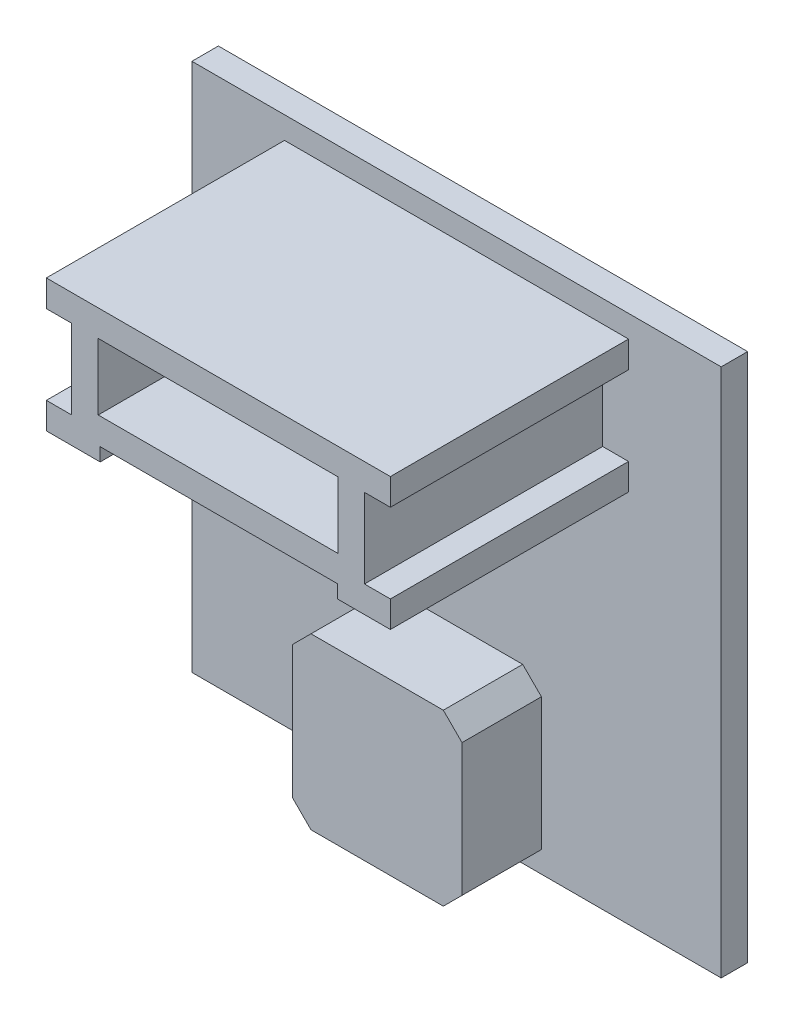
ISO-10303-21;
HEADER;
FILE_DESCRIPTION(('STEP AP214'),'2;1');
FILE_NAME('part.step','',(''),(''),'','','');
FILE_SCHEMA(('AUTOMOTIVE_DESIGN { 1 0 10303 214 1 1 1 1 }'));
ENDSEC;
DATA;
#1=APPLICATION_CONTEXT('core data for automotive mechanical design processes');
#2=APPLICATION_PROTOCOL_DEFINITION('international standard','automotive_design',2000,#1);
#3=PRODUCT_CONTEXT('',#1,'mechanical');
#4=PRODUCT('Part','Part','',(#3));
#5=PRODUCT_RELATED_PRODUCT_CATEGORY('part','',(#4));
#6=PRODUCT_DEFINITION_FORMATION('','',#4);
#7=PRODUCT_DEFINITION_CONTEXT('part definition',#1,'design');
#8=PRODUCT_DEFINITION('design','',#6,#7);
#9=PRODUCT_DEFINITION_SHAPE('','',#8);
#10=(LENGTH_UNIT() NAMED_UNIT(*) SI_UNIT(.MILLI.,.METRE.));
#11=(NAMED_UNIT(*) PLANE_ANGLE_UNIT() SI_UNIT($,.RADIAN.));
#12=(NAMED_UNIT(*) SI_UNIT($,.STERADIAN.) SOLID_ANGLE_UNIT());
#13=UNCERTAINTY_MEASURE_WITH_UNIT(LENGTH_MEASURE(1.E-05),#10,'distance_accuracy_value','');
#14=(GEOMETRIC_REPRESENTATION_CONTEXT(3) GLOBAL_UNCERTAINTY_ASSIGNED_CONTEXT((#13)) GLOBAL_UNIT_ASSIGNED_CONTEXT((#10,
#11,#12)) REPRESENTATION_CONTEXT('',''));
#15=CARTESIAN_POINT('',(0.,0.,0.));
#16=DIRECTION('',(0.,0.,1.));
#17=DIRECTION('',(1.,0.,0.));
#18=AXIS2_PLACEMENT_3D('',#15,#16,#17);
#19=CARTESIAN_POINT('',(0.,0.,0.1));
#20=DIRECTION('',(0.,0.,-1.));
#21=DIRECTION('',(-1.,0.,0.));
#22=AXIS2_PLACEMENT_3D('',#19,#20,#21);
#23=PLANE('',#22);
#24=DIRECTION('',(0.,-1.,0.));
#25=VECTOR('',#24,1.);
#26=CARTESIAN_POINT('',(0.35,1.81542552277499,0.1));
#27=LINE('',#26,#25);
#28=CARTESIAN_POINT('',(0.35,1.91603756719199,0.1));
#29=VERTEX_POINT('',#28);
#30=CARTESIAN_POINT('',(0.35,1.81542552277499,0.1));
#31=VERTEX_POINT('',#30);
#32=EDGE_CURVE('E308',#29,#31,#27,.T.);
#33=ORIENTED_EDGE('',*,*,#32,.F.);
#34=DIRECTION('',(-1.,0.,0.));
#35=VECTOR('',#34,1.);
#36=CARTESIAN_POINT('',(0.35,1.91603756719199,0.1));
#37=LINE('',#36,#35);
#38=CARTESIAN_POINT('',(1.65,1.91603756719199,0.1));
#39=VERTEX_POINT('',#38);
#40=EDGE_CURVE('E313',#39,#29,#37,.T.);
#41=ORIENTED_EDGE('',*,*,#40,.F.);
#42=DIRECTION('',(0.,1.,0.));
#43=VECTOR('',#42,1.);
#44=CARTESIAN_POINT('',(1.65,1.91603756719199,0.1));
#45=LINE('',#44,#43);
#46=CARTESIAN_POINT('',(1.65,1.81542552277499,0.1));
#47=VERTEX_POINT('',#46);
#48=EDGE_CURVE('E385',#47,#39,#45,.T.);
#49=ORIENTED_EDGE('',*,*,#48,.F.);
#50=DIRECTION('',(1.,0.,0.));
#51=VECTOR('',#50,1.);
#52=CARTESIAN_POINT('',(1.65,1.81542552277499,0.1));
#53=LINE('',#52,#51);
#54=CARTESIAN_POINT('',(1.5520790721583,1.81542552277499,0.1));
#55=VERTEX_POINT('',#54);
#56=EDGE_CURVE('E382',#55,#47,#53,.T.);
#57=ORIENTED_EDGE('',*,*,#56,.F.);
#58=DIRECTION('',(0.,1.,0.));
#59=VECTOR('',#58,1.);
#60=CARTESIAN_POINT('',(1.5520790721583,1.81542552277499,0.1));
#61=LINE('',#60,#59);
#62=CARTESIAN_POINT('',(1.5520790721583,1.51542552277499,0.1));
#63=VERTEX_POINT('',#62);
#64=EDGE_CURVE('E379',#63,#55,#61,.T.);
#65=ORIENTED_EDGE('',*,*,#64,.F.);
#66=DIRECTION('',(-1.,0.,0.));
#67=VECTOR('',#66,1.);
#68=CARTESIAN_POINT('',(1.5520790721583,1.51542552277499,0.1));
#69=LINE('',#68,#67);
#70=CARTESIAN_POINT('',(1.65,1.51542552277499,0.1));
#71=VERTEX_POINT('',#70);
#72=EDGE_CURVE('E376',#71,#63,#69,.T.);
#73=ORIENTED_EDGE('',*,*,#72,.F.);
#74=DIRECTION('',(0.,1.,0.));
#75=VECTOR('',#74,1.);
#76=CARTESIAN_POINT('',(1.65,1.51542552277499,0.1));
#77=LINE('',#76,#75);
#78=CARTESIAN_POINT('',(1.65,1.41542552277499,0.1));
#79=VERTEX_POINT('',#78);
#80=EDGE_CURVE('E373',#79,#71,#77,.T.);
#81=ORIENTED_EDGE('',*,*,#80,.F.);
#82=DIRECTION('',(1.,0.,0.));
#83=VECTOR('',#82,1.);
#84=CARTESIAN_POINT('',(1.45,1.41542552277499,0.1));
#85=LINE('',#84,#83);
#86=CARTESIAN_POINT('',(1.45,1.41542552277499,0.1));
#87=VERTEX_POINT('',#86);
#88=EDGE_CURVE('E370',#87,#79,#85,.T.);
#89=ORIENTED_EDGE('',*,*,#88,.F.);
#90=DIRECTION('',(0.,-1.,0.));
#91=VECTOR('',#90,1.);
#92=CARTESIAN_POINT('',(1.45,1.46542552277499,0.1));
#93=LINE('',#92,#91);
#94=CARTESIAN_POINT('',(1.45,1.46542552277499,0.1));
#95=VERTEX_POINT('',#94);
#96=EDGE_CURVE('E367',#95,#87,#93,.T.);
#97=ORIENTED_EDGE('',*,*,#96,.F.);
#98=DIRECTION('',(1.,0.,0.));
#99=VECTOR('',#98,1.);
#100=CARTESIAN_POINT('',(0.553370886434268,1.46542552277499,0.1));
#101=LINE('',#100,#99);
#102=CARTESIAN_POINT('',(0.553370886434268,1.46542552277499,0.1));
#103=VERTEX_POINT('',#102);
#104=EDGE_CURVE('E364',#103,#95,#101,.T.);
#105=ORIENTED_EDGE('',*,*,#104,.F.);
#106=DIRECTION('',(0.,1.,0.));
#107=VECTOR('',#106,1.);
#108=CARTESIAN_POINT('',(0.553370886434268,1.41542552277499,0.1));
#109=LINE('',#108,#107);
#110=CARTESIAN_POINT('',(0.553370886434268,1.41542552277499,0.1));
#111=VERTEX_POINT('',#110);
#112=EDGE_CURVE('E361',#111,#103,#109,.T.);
#113=ORIENTED_EDGE('',*,*,#112,.F.);
#114=DIRECTION('',(1.,0.,0.));
#115=VECTOR('',#114,1.);
#116=CARTESIAN_POINT('',(0.349999999999999,1.41542552277499,0.1));
#117=LINE('',#116,#115);
#118=CARTESIAN_POINT('',(0.349999999999999,1.41542552277499,0.1));
#119=VERTEX_POINT('',#118);
#120=EDGE_CURVE('E358',#119,#111,#117,.T.);
#121=ORIENTED_EDGE('',*,*,#120,.F.);
#122=DIRECTION('',(0.,-1.,0.));
#123=VECTOR('',#122,1.);
#124=CARTESIAN_POINT('',(0.349999999999999,1.41542552277499,0.1));
#125=LINE('',#124,#123);
#126=CARTESIAN_POINT('',(0.349999999999999,1.51542552277499,0.1));
#127=VERTEX_POINT('',#126);
#128=EDGE_CURVE('E355',#127,#119,#125,.T.);
#129=ORIENTED_EDGE('',*,*,#128,.F.);
#130=DIRECTION('',(-1.,0.,0.));
#131=VECTOR('',#130,1.);
#132=CARTESIAN_POINT('',(0.349999999999999,1.51542552277499,0.1));
#133=LINE('',#132,#131);
#134=CARTESIAN_POINT('',(0.445932414444116,1.51542552277499,0.1));
#135=VERTEX_POINT('',#134);
#136=EDGE_CURVE('E352',#135,#127,#133,.T.);
#137=ORIENTED_EDGE('',*,*,#136,.F.);
#138=DIRECTION('',(0.,-1.,0.));
#139=VECTOR('',#138,1.);
#140=CARTESIAN_POINT('',(0.445932414444116,1.51542552277499,0.1));
#141=LINE('',#140,#139);
#142=CARTESIAN_POINT('',(0.445932414444116,1.81542552277499,0.1));
#143=VERTEX_POINT('',#142);
#144=EDGE_CURVE('E349',#143,#135,#141,.T.);
#145=ORIENTED_EDGE('',*,*,#144,.F.);
#146=DIRECTION('',(1.,0.,0.));
#147=VECTOR('',#146,1.);
#148=CARTESIAN_POINT('',(0.445932414444116,1.81542552277499,0.1));
#149=LINE('',#148,#147);
#150=EDGE_CURVE('E346',#31,#143,#149,.T.);
#151=ORIENTED_EDGE('',*,*,#150,.F.);
#152=EDGE_LOOP('',(#33,#41,#49,#57,#65,#73,#81,#89,#97,#105,#113,#121,#129,#137,#145,#151));
#153=FACE_BOUND('',#152,.T.);
#154=DIRECTION('',(0.,-1.,0.));
#155=VECTOR('',#154,1.);
#156=CARTESIAN_POINT('',(0.,0.,0.1));
#157=LINE('',#156,#155);
#158=CARTESIAN_POINT('',(0.,2.,0.1));
#159=VERTEX_POINT('',#158);
#160=CARTESIAN_POINT('',(0.,0.,0.1));
#161=VERTEX_POINT('',#160);
#162=EDGE_CURVE('E438',#159,#161,#157,.T.);
#163=ORIENTED_EDGE('',*,*,#162,.T.);
#164=DIRECTION('',(1.,0.,0.));
#165=VECTOR('',#164,1.);
#166=CARTESIAN_POINT('',(0.,0.,0.1));
#167=LINE('',#166,#165);
#168=CARTESIAN_POINT('',(2.,0.,0.1));
#169=VERTEX_POINT('',#168);
#170=EDGE_CURVE('E441',#161,#169,#167,.T.);
#171=ORIENTED_EDGE('',*,*,#170,.T.);
#172=DIRECTION('',(0.,1.,0.));
#173=VECTOR('',#172,1.);
#174=CARTESIAN_POINT('',(2.,0.,0.1));
#175=LINE('',#174,#173);
#176=CARTESIAN_POINT('',(2.,2.,0.1));
#177=VERTEX_POINT('',#176);
#178=EDGE_CURVE('E444',#169,#177,#175,.T.);
#179=ORIENTED_EDGE('',*,*,#178,.T.);
#180=DIRECTION('',(-1.,0.,0.));
#181=VECTOR('',#180,1.);
#182=CARTESIAN_POINT('',(0.,2.,0.1));
#183=LINE('',#182,#181);
#184=EDGE_CURVE('E446',#177,#159,#183,.T.);
#185=ORIENTED_EDGE('',*,*,#184,.T.);
#186=EDGE_LOOP('',(#163,#171,#179,#185));
#187=FACE_BOUND('',#186,.T.);
#188=DIRECTION('',(-0.707106781186548,-0.707106781186547,0.));
#189=VECTOR('',#188,1.);
#190=CARTESIAN_POINT('',(0.75,0.651421356237309,0.1));
#191=LINE('',#190,#189);
#192=CARTESIAN_POINT('',(0.75,0.651421356237309,0.1));
#193=VERTEX_POINT('',#192);
#194=CARTESIAN_POINT('',(0.679289321881345,0.580710678118654,0.1));
#195=VERTEX_POINT('',#194);
#196=EDGE_CURVE('E268',#193,#195,#191,.T.);
#197=ORIENTED_EDGE('',*,*,#196,.F.);
#198=DIRECTION('',(-1.,0.,0.));
#199=VECTOR('',#198,1.);
#200=CARTESIAN_POINT('',(1.25,0.651421356237309,0.1));
#201=LINE('',#200,#199);
#202=CARTESIAN_POINT('',(1.25,0.651421356237309,0.1));
#203=VERTEX_POINT('',#202);
#204=EDGE_CURVE('E265',#203,#193,#201,.T.);
#205=ORIENTED_EDGE('',*,*,#204,.F.);
#206=DIRECTION('',(-0.707106781186548,0.707106781186547,0.));
#207=VECTOR('',#206,1.);
#208=CARTESIAN_POINT('',(1.32071067811865,0.580710678118654,0.1));
#209=LINE('',#208,#207);
#210=CARTESIAN_POINT('',(1.32071067811865,0.580710678118654,0.1));
#211=VERTEX_POINT('',#210);
#212=EDGE_CURVE('E958',#211,#203,#209,.T.);
#213=ORIENTED_EDGE('',*,*,#212,.F.);
#214=DIRECTION('',(0.,1.,0.));
#215=VECTOR('',#214,1.);
#216=CARTESIAN_POINT('',(1.32071067811865,0.080710678118655,0.1));
#217=LINE('',#216,#215);
#218=CARTESIAN_POINT('',(1.32071067811865,0.080710678118655,0.1));
#219=VERTEX_POINT('',#218);
#220=EDGE_CURVE('E989',#219,#211,#217,.T.);
#221=ORIENTED_EDGE('',*,*,#220,.F.);
#222=DIRECTION('',(0.707106781186547,0.707106781186548,0.));
#223=VECTOR('',#222,1.);
#224=CARTESIAN_POINT('',(1.25,0.01,0.1));
#225=LINE('',#224,#223);
#226=CARTESIAN_POINT('',(1.25,0.0100000000000002,0.1));
#227=VERTEX_POINT('',#226);
#228=EDGE_CURVE('E982',#227,#219,#225,.T.);
#229=ORIENTED_EDGE('',*,*,#228,.F.);
#230=DIRECTION('',(1.,0.,0.));
#231=VECTOR('',#230,1.);
#232=CARTESIAN_POINT('',(0.75,0.01,0.1));
#233=LINE('',#232,#231);
#234=CARTESIAN_POINT('',(0.75,0.01,0.1));
#235=VERTEX_POINT('',#234);
#236=EDGE_CURVE('E979',#235,#227,#233,.T.);
#237=ORIENTED_EDGE('',*,*,#236,.F.);
#238=DIRECTION('',(0.707106781186549,-0.707106781186546,0.));
#239=VECTOR('',#238,1.);
#240=CARTESIAN_POINT('',(0.679289321881345,0.0807106781186544,0.1));
#241=LINE('',#240,#239);
#242=CARTESIAN_POINT('',(0.679289321881345,0.0807106781186544,0.1));
#243=VERTEX_POINT('',#242);
#244=EDGE_CURVE('E59',#243,#235,#241,.T.);
#245=ORIENTED_EDGE('',*,*,#244,.F.);
#246=DIRECTION('',(0.,-1.,0.));
#247=VECTOR('',#246,1.);
#248=CARTESIAN_POINT('',(0.679289321881345,0.580710678118654,0.1));
#249=LINE('',#248,#247);
#250=EDGE_CURVE('E54',#195,#243,#249,.T.);
#251=ORIENTED_EDGE('',*,*,#250,.F.);
#252=EDGE_LOOP('',(#197,#205,#213,#221,#229,#237,#245,#251));
#253=FACE_BOUND('',#252,.T.);
#254=ADVANCED_FACE('F39',(#153,#187,#253),#23,.F.);
#255=CARTESIAN_POINT('',(0.,0.,1.));
#256=DIRECTION('',(0.,0.,-1.));
#257=DIRECTION('',(-1.,0.,0.));
#258=AXIS2_PLACEMENT_3D('',#255,#256,#257);
#259=PLANE('',#258);
#260=DIRECTION('',(0.,-1.,0.));
#261=VECTOR('',#260,1.);
#262=CARTESIAN_POINT('',(0.35,1.81542552277499,1.));
#263=LINE('',#262,#261);
#264=CARTESIAN_POINT('',(0.35,1.91603756719199,1.));
#265=VERTEX_POINT('',#264);
#266=CARTESIAN_POINT('',(0.35,1.81542552277499,1.));
#267=VERTEX_POINT('',#266);
#268=EDGE_CURVE('E309',#265,#267,#263,.T.);
#269=ORIENTED_EDGE('',*,*,#268,.T.);
#270=DIRECTION('',(1.,0.,0.));
#271=VECTOR('',#270,1.);
#272=CARTESIAN_POINT('',(0.445932414444116,1.81542552277499,1.));
#273=LINE('',#272,#271);
#274=CARTESIAN_POINT('',(0.445932414444116,1.81542552277499,1.));
#275=VERTEX_POINT('',#274);
#276=EDGE_CURVE('E312',#267,#275,#273,.T.);
#277=ORIENTED_EDGE('',*,*,#276,.T.);
#278=DIRECTION('',(0.,-1.,0.));
#279=VECTOR('',#278,1.);
#280=CARTESIAN_POINT('',(0.445932414444116,1.51542552277499,1.));
#281=LINE('',#280,#279);
#282=CARTESIAN_POINT('',(0.445932414444116,1.51542552277499,1.));
#283=VERTEX_POINT('',#282);
#284=EDGE_CURVE('E315',#275,#283,#281,.T.);
#285=ORIENTED_EDGE('',*,*,#284,.T.);
#286=DIRECTION('',(-1.,0.,0.));
#287=VECTOR('',#286,1.);
#288=CARTESIAN_POINT('',(0.349999999999999,1.51542552277499,1.));
#289=LINE('',#288,#287);
#290=CARTESIAN_POINT('',(0.349999999999999,1.51542552277499,1.));
#291=VERTEX_POINT('',#290);
#292=EDGE_CURVE('E317',#283,#291,#289,.T.);
#293=ORIENTED_EDGE('',*,*,#292,.T.);
#294=DIRECTION('',(0.,-1.,0.));
#295=VECTOR('',#294,1.);
#296=CARTESIAN_POINT('',(0.349999999999999,1.41542552277499,1.));
#297=LINE('',#296,#295);
#298=CARTESIAN_POINT('',(0.349999999999999,1.41542552277499,1.));
#299=VERTEX_POINT('',#298);
#300=EDGE_CURVE('E319',#291,#299,#297,.T.);
#301=ORIENTED_EDGE('',*,*,#300,.T.);
#302=DIRECTION('',(1.,0.,0.));
#303=VECTOR('',#302,1.);
#304=CARTESIAN_POINT('',(0.349999999999999,1.41542552277499,1.));
#305=LINE('',#304,#303);
#306=CARTESIAN_POINT('',(0.553370886434268,1.41542552277499,1.));
#307=VERTEX_POINT('',#306);
#308=EDGE_CURVE('E321',#299,#307,#305,.T.);
#309=ORIENTED_EDGE('',*,*,#308,.T.);
#310=DIRECTION('',(0.,1.,0.));
#311=VECTOR('',#310,1.);
#312=CARTESIAN_POINT('',(0.553370886434268,1.41542552277499,1.));
#313=LINE('',#312,#311);
#314=CARTESIAN_POINT('',(0.553370886434268,1.46542552277499,1.));
#315=VERTEX_POINT('',#314);
#316=EDGE_CURVE('E323',#307,#315,#313,.T.);
#317=ORIENTED_EDGE('',*,*,#316,.T.);
#318=DIRECTION('',(1.,0.,0.));
#319=VECTOR('',#318,1.);
#320=CARTESIAN_POINT('',(0.553370886434268,1.46542552277499,1.));
#321=LINE('',#320,#319);
#322=CARTESIAN_POINT('',(1.45,1.46542552277499,1.));
#323=VERTEX_POINT('',#322);
#324=EDGE_CURVE('E325',#315,#323,#321,.T.);
#325=ORIENTED_EDGE('',*,*,#324,.T.);
#326=DIRECTION('',(0.,-1.,0.));
#327=VECTOR('',#326,1.);
#328=CARTESIAN_POINT('',(1.45,1.46542552277499,1.));
#329=LINE('',#328,#327);
#330=CARTESIAN_POINT('',(1.45,1.41542552277499,1.));
#331=VERTEX_POINT('',#330);
#332=EDGE_CURVE('E327',#323,#331,#329,.T.);
#333=ORIENTED_EDGE('',*,*,#332,.T.);
#334=DIRECTION('',(1.,0.,0.));
#335=VECTOR('',#334,1.);
#336=CARTESIAN_POINT('',(1.45,1.41542552277499,1.));
#337=LINE('',#336,#335);
#338=CARTESIAN_POINT('',(1.65,1.41542552277499,1.));
#339=VERTEX_POINT('',#338);
#340=EDGE_CURVE('E329',#331,#339,#337,.T.);
#341=ORIENTED_EDGE('',*,*,#340,.T.);
#342=DIRECTION('',(0.,1.,0.));
#343=VECTOR('',#342,1.);
#344=CARTESIAN_POINT('',(1.65,1.51542552277499,1.));
#345=LINE('',#344,#343);
#346=CARTESIAN_POINT('',(1.65,1.51542552277499,1.));
#347=VERTEX_POINT('',#346);
#348=EDGE_CURVE('E331',#339,#347,#345,.T.);
#349=ORIENTED_EDGE('',*,*,#348,.T.);
#350=DIRECTION('',(-1.,0.,0.));
#351=VECTOR('',#350,1.);
#352=CARTESIAN_POINT('',(1.5520790721583,1.51542552277499,1.));
#353=LINE('',#352,#351);
#354=CARTESIAN_POINT('',(1.5520790721583,1.51542552277499,1.));
#355=VERTEX_POINT('',#354);
#356=EDGE_CURVE('E333',#347,#355,#353,.T.);
#357=ORIENTED_EDGE('',*,*,#356,.T.);
#358=DIRECTION('',(0.,1.,0.));
#359=VECTOR('',#358,1.);
#360=CARTESIAN_POINT('',(1.5520790721583,1.81542552277499,1.));
#361=LINE('',#360,#359);
#362=CARTESIAN_POINT('',(1.5520790721583,1.81542552277499,1.));
#363=VERTEX_POINT('',#362);
#364=EDGE_CURVE('E335',#355,#363,#361,.T.);
#365=ORIENTED_EDGE('',*,*,#364,.T.);
#366=DIRECTION('',(1.,0.,0.));
#367=VECTOR('',#366,1.);
#368=CARTESIAN_POINT('',(1.65,1.81542552277499,1.));
#369=LINE('',#368,#367);
#370=CARTESIAN_POINT('',(1.65,1.81542552277499,1.));
#371=VERTEX_POINT('',#370);
#372=EDGE_CURVE('E337',#363,#371,#369,.T.);
#373=ORIENTED_EDGE('',*,*,#372,.T.);
#374=DIRECTION('',(0.,1.,0.));
#375=VECTOR('',#374,1.);
#376=CARTESIAN_POINT('',(1.65,1.91603756719199,1.));
#377=LINE('',#376,#375);
#378=CARTESIAN_POINT('',(1.65,1.91603756719199,1.));
#379=VERTEX_POINT('',#378);
#380=EDGE_CURVE('E339',#371,#379,#377,.T.);
#381=ORIENTED_EDGE('',*,*,#380,.T.);
#382=DIRECTION('',(-1.,0.,0.));
#383=VECTOR('',#382,1.);
#384=CARTESIAN_POINT('',(0.35,1.91603756719199,1.));
#385=LINE('',#384,#383);
#386=EDGE_CURVE('E341',#379,#265,#385,.T.);
#387=ORIENTED_EDGE('',*,*,#386,.T.);
#388=EDGE_LOOP('',(#269,#277,#285,#293,#301,#309,#317,#325,#333,#341,#349,#357,#365,#373,#381,#387));
#389=FACE_BOUND('',#388,.T.);
#390=DIRECTION('',(-1.,0.,0.));
#391=VECTOR('',#390,1.);
#392=CARTESIAN_POINT('',(0.,1.81603756719199,1.));
#393=LINE('',#392,#391);
#394=CARTESIAN_POINT('',(1.4520790721583,1.81603756719199,1.));
#395=VERTEX_POINT('',#394);
#396=CARTESIAN_POINT('',(0.545932414444116,1.81603756719199,1.));
#397=VERTEX_POINT('',#396);
#398=EDGE_CURVE('E282',#395,#397,#393,.T.);
#399=ORIENTED_EDGE('',*,*,#398,.F.);
#400=DIRECTION('',(0.,1.,0.));
#401=VECTOR('',#400,1.);
#402=CARTESIAN_POINT('',(1.4520790721583,0.,1.));
#403=LINE('',#402,#401);
#404=CARTESIAN_POINT('',(1.4520790721583,1.56542552277499,1.));
#405=VERTEX_POINT('',#404);
#406=EDGE_CURVE('E279',#405,#395,#403,.T.);
#407=ORIENTED_EDGE('',*,*,#406,.F.);
#408=DIRECTION('',(1.,0.,0.));
#409=VECTOR('',#408,1.);
#410=CARTESIAN_POINT('',(0.,1.56542552277499,1.));
#411=LINE('',#410,#409);
#412=CARTESIAN_POINT('',(0.545932414444116,1.56542552277499,1.));
#413=VERTEX_POINT('',#412);
#414=EDGE_CURVE('E272',#413,#405,#411,.T.);
#415=ORIENTED_EDGE('',*,*,#414,.F.);
#416=DIRECTION('',(0.,-1.,0.));
#417=VECTOR('',#416,1.);
#418=CARTESIAN_POINT('',(0.545932414444116,0.,1.));
#419=LINE('',#418,#417);
#420=EDGE_CURVE('E269',#397,#413,#419,.T.);
#421=ORIENTED_EDGE('',*,*,#420,.F.);
#422=EDGE_LOOP('',(#399,#407,#415,#421));
#423=FACE_BOUND('',#422,.T.);
#424=ADVANCED_FACE('F487',(#389,#423),#259,.F.);
#425=CARTESIAN_POINT('',(0.,0.,0.1));
#426=DIRECTION('',(1.,0.,0.));
#427=DIRECTION('',(0.,1.,0.));
#428=AXIS2_PLACEMENT_3D('',#425,#426,#427);
#429=PLANE('',#428);
#430=DIRECTION('',(0.,-1.,0.));
#431=VECTOR('',#430,1.);
#432=CARTESIAN_POINT('',(0.,0.,0.));
#433=LINE('',#432,#431);
#434=CARTESIAN_POINT('',(0.,2.,0.));
#435=VERTEX_POINT('',#434);
#436=CARTESIAN_POINT('',(0.,0.,0.));
#437=VERTEX_POINT('',#436);
#438=EDGE_CURVE('E437',#435,#437,#433,.T.);
#439=ORIENTED_EDGE('',*,*,#438,.T.);
#440=DIRECTION('',(0.,0.,-1.));
#441=VECTOR('',#440,1.);
#442=CARTESIAN_POINT('',(0.,0.,0.1));
#443=LINE('',#442,#441);
#444=EDGE_CURVE('E11',#161,#437,#443,.T.);
#445=ORIENTED_EDGE('',*,*,#444,.F.);
#446=ORIENTED_EDGE('',*,*,#162,.F.);
#447=DIRECTION('',(0.,0.,-1.));
#448=VECTOR('',#447,1.);
#449=CARTESIAN_POINT('',(0.,2.,0.1));
#450=LINE('',#449,#448);
#451=EDGE_CURVE('E448',#159,#435,#450,.T.);
#452=ORIENTED_EDGE('',*,*,#451,.T.);
#453=EDGE_LOOP('',(#439,#445,#446,#452));
#454=FACE_BOUND('',#453,.T.);
#455=ADVANCED_FACE('F41',(#454),#429,.F.);
#456=CARTESIAN_POINT('',(0.,0.,0.1));
#457=DIRECTION('',(0.,1.,0.));
#458=DIRECTION('',(0.,0.,1.));
#459=AXIS2_PLACEMENT_3D('',#456,#457,#458);
#460=PLANE('',#459);
#461=DIRECTION('',(1.,0.,0.));
#462=VECTOR('',#461,1.);
#463=CARTESIAN_POINT('',(0.,0.,0.));
#464=LINE('',#463,#462);
#465=CARTESIAN_POINT('',(2.,0.,0.));
#466=VERTEX_POINT('',#465);
#467=EDGE_CURVE('E451',#437,#466,#464,.T.);
#468=ORIENTED_EDGE('',*,*,#467,.T.);
#469=DIRECTION('',(0.,0.,-1.));
#470=VECTOR('',#469,1.);
#471=CARTESIAN_POINT('',(2.,0.,0.1));
#472=LINE('',#471,#470);
#473=EDGE_CURVE('E47',#169,#466,#472,.T.);
#474=ORIENTED_EDGE('',*,*,#473,.F.);
#475=ORIENTED_EDGE('',*,*,#170,.F.);
#476=ORIENTED_EDGE('',*,*,#444,.T.);
#477=EDGE_LOOP('',(#468,#474,#475,#476));
#478=FACE_BOUND('',#477,.T.);
#479=ADVANCED_FACE('F480',(#478),#460,.F.);
#480=CARTESIAN_POINT('',(2.,0.,0.1));
#481=DIRECTION('',(-1.,0.,0.));
#482=DIRECTION('',(0.,-1.,0.));
#483=AXIS2_PLACEMENT_3D('',#480,#481,#482);
#484=PLANE('',#483);
#485=DIRECTION('',(0.,1.,0.));
#486=VECTOR('',#485,1.);
#487=CARTESIAN_POINT('',(2.,0.,0.));
#488=LINE('',#487,#486);
#489=CARTESIAN_POINT('',(2.,2.,0.));
#490=VERTEX_POINT('',#489);
#491=EDGE_CURVE('E453',#466,#490,#488,.T.);
#492=ORIENTED_EDGE('',*,*,#491,.T.);
#493=DIRECTION('',(0.,0.,-1.));
#494=VECTOR('',#493,1.);
#495=CARTESIAN_POINT('',(2.,2.,0.1));
#496=LINE('',#495,#494);
#497=EDGE_CURVE('E458',#177,#490,#496,.T.);
#498=ORIENTED_EDGE('',*,*,#497,.F.);
#499=ORIENTED_EDGE('',*,*,#178,.F.);
#500=ORIENTED_EDGE('',*,*,#473,.T.);
#501=EDGE_LOOP('',(#492,#498,#499,#500));
#502=FACE_BOUND('',#501,.T.);
#503=ADVANCED_FACE('F465',(#502),#484,.F.);
#504=CARTESIAN_POINT('',(0.,2.,0.1));
#505=DIRECTION('',(0.,-1.,0.));
#506=DIRECTION('',(0.,0.,-1.));
#507=AXIS2_PLACEMENT_3D('',#504,#505,#506);
#508=PLANE('',#507);
#509=DIRECTION('',(-1.,0.,0.));
#510=VECTOR('',#509,1.);
#511=CARTESIAN_POINT('',(0.,2.,0.));
#512=LINE('',#511,#510);
#513=EDGE_CURVE('E442',#490,#435,#512,.T.);
#514=ORIENTED_EDGE('',*,*,#513,.T.);
#515=ORIENTED_EDGE('',*,*,#451,.F.);
#516=ORIENTED_EDGE('',*,*,#184,.F.);
#517=ORIENTED_EDGE('',*,*,#497,.T.);
#518=EDGE_LOOP('',(#514,#515,#516,#517));
#519=FACE_BOUND('',#518,.T.);
#520=ADVANCED_FACE('F474',(#519),#508,.F.);
#521=CARTESIAN_POINT('',(0.,0.,0.));
#522=DIRECTION('',(0.,0.,-1.));
#523=DIRECTION('',(-1.,0.,0.));
#524=AXIS2_PLACEMENT_3D('',#521,#522,#523);
#525=PLANE('',#524);
#526=ORIENTED_EDGE('',*,*,#438,.F.);
#527=ORIENTED_EDGE('',*,*,#513,.F.);
#528=ORIENTED_EDGE('',*,*,#491,.F.);
#529=ORIENTED_EDGE('',*,*,#467,.F.);
#530=EDGE_LOOP('',(#526,#527,#528,#529));
#531=FACE_BOUND('',#530,.T.);
#532=ADVANCED_FACE('F471',(#531),#525,.T.);
#533=CARTESIAN_POINT('',(0.35,1.81542552277499,1.));
#534=DIRECTION('',(1.,0.,0.));
#535=DIRECTION('',(0.,0.,-1.));
#536=AXIS2_PLACEMENT_3D('',#533,#534,#535);
#537=PLANE('',#536);
#538=ORIENTED_EDGE('',*,*,#32,.T.);
#539=DIRECTION('',(0.,0.,-1.));
#540=VECTOR('',#539,1.);
#541=CARTESIAN_POINT('',(0.35,1.81542552277499,1.));
#542=LINE('',#541,#540);
#543=EDGE_CURVE('E434',#267,#31,#542,.T.);
#544=ORIENTED_EDGE('',*,*,#543,.F.);
#545=ORIENTED_EDGE('',*,*,#268,.F.);
#546=DIRECTION('',(0.,0.,-1.));
#547=VECTOR('',#546,1.);
#548=CARTESIAN_POINT('',(0.35,1.91603756719199,1.));
#549=LINE('',#548,#547);
#550=EDGE_CURVE('E343',#265,#29,#549,.T.);
#551=ORIENTED_EDGE('',*,*,#550,.T.);
#552=EDGE_LOOP('',(#538,#544,#545,#551));
#553=FACE_BOUND('',#552,.T.);
#554=ADVANCED_FACE('F498',(#553),#537,.F.);
#555=CARTESIAN_POINT('',(0.445932414444116,1.81542552277499,1.));
#556=DIRECTION('',(0.,1.,0.));
#557=DIRECTION('',(0.,0.,1.));
#558=AXIS2_PLACEMENT_3D('',#555,#556,#557);
#559=PLANE('',#558);
#560=ORIENTED_EDGE('',*,*,#150,.T.);
#561=DIRECTION('',(0.,0.,-1.));
#562=VECTOR('',#561,1.);
#563=CARTESIAN_POINT('',(0.445932414444116,1.81542552277499,1.));
#564=LINE('',#563,#562);
#565=EDGE_CURVE('E431',#275,#143,#564,.T.);
#566=ORIENTED_EDGE('',*,*,#565,.F.);
#567=ORIENTED_EDGE('',*,*,#276,.F.);
#568=ORIENTED_EDGE('',*,*,#543,.T.);
#569=EDGE_LOOP('',(#560,#566,#567,#568));
#570=FACE_BOUND('',#569,.T.);
#571=ADVANCED_FACE('F518',(#570),#559,.F.);
#572=CARTESIAN_POINT('',(0.445932414444116,1.51542552277499,1.));
#573=DIRECTION('',(1.,0.,0.));
#574=DIRECTION('',(0.,0.,-1.));
#575=AXIS2_PLACEMENT_3D('',#572,#573,#574);
#576=PLANE('',#575);
#577=ORIENTED_EDGE('',*,*,#144,.T.);
#578=DIRECTION('',(0.,0.,-1.));
#579=VECTOR('',#578,1.);
#580=CARTESIAN_POINT('',(0.445932414444116,1.51542552277499,1.));
#581=LINE('',#580,#579);
#582=EDGE_CURVE('E428',#283,#135,#581,.T.);
#583=ORIENTED_EDGE('',*,*,#582,.F.);
#584=ORIENTED_EDGE('',*,*,#284,.F.);
#585=ORIENTED_EDGE('',*,*,#565,.T.);
#586=EDGE_LOOP('',(#577,#583,#584,#585));
#587=FACE_BOUND('',#586,.T.);
#588=ADVANCED_FACE('F526',(#587),#576,.F.);
#589=CARTESIAN_POINT('',(0.349999999999999,1.51542552277499,1.));
#590=DIRECTION('',(0.,-1.,0.));
#591=DIRECTION('',(0.,0.,-1.));
#592=AXIS2_PLACEMENT_3D('',#589,#590,#591);
#593=PLANE('',#592);
#594=ORIENTED_EDGE('',*,*,#136,.T.);
#595=DIRECTION('',(0.,0.,-1.));
#596=VECTOR('',#595,1.);
#597=CARTESIAN_POINT('',(0.349999999999999,1.51542552277499,1.));
#598=LINE('',#597,#596);
#599=EDGE_CURVE('E425',#291,#127,#598,.T.);
#600=ORIENTED_EDGE('',*,*,#599,.F.);
#601=ORIENTED_EDGE('',*,*,#292,.F.);
#602=ORIENTED_EDGE('',*,*,#582,.T.);
#603=EDGE_LOOP('',(#594,#600,#601,#602));
#604=FACE_BOUND('',#603,.T.);
#605=ADVANCED_FACE('F533',(#604),#593,.F.);
#606=CARTESIAN_POINT('',(0.349999999999999,1.41542552277499,1.));
#607=DIRECTION('',(1.,0.,0.));
#608=DIRECTION('',(0.,1.,0.));
#609=AXIS2_PLACEMENT_3D('',#606,#607,#608);
#610=PLANE('',#609);
#611=ORIENTED_EDGE('',*,*,#128,.T.);
#612=DIRECTION('',(0.,0.,-1.));
#613=VECTOR('',#612,1.);
#614=CARTESIAN_POINT('',(0.349999999999999,1.41542552277499,1.));
#615=LINE('',#614,#613);
#616=EDGE_CURVE('E422',#299,#119,#615,.T.);
#617=ORIENTED_EDGE('',*,*,#616,.F.);
#618=ORIENTED_EDGE('',*,*,#300,.F.);
#619=ORIENTED_EDGE('',*,*,#599,.T.);
#620=EDGE_LOOP('',(#611,#617,#618,#619));
#621=FACE_BOUND('',#620,.T.);
#622=ADVANCED_FACE('F541',(#621),#610,.F.);
#623=CARTESIAN_POINT('',(0.349999999999999,1.41542552277499,1.));
#624=DIRECTION('',(0.,1.,0.));
#625=DIRECTION('',(0.,0.,1.));
#626=AXIS2_PLACEMENT_3D('',#623,#624,#625);
#627=PLANE('',#626);
#628=ORIENTED_EDGE('',*,*,#120,.T.);
#629=DIRECTION('',(0.,0.,-1.));
#630=VECTOR('',#629,1.);
#631=CARTESIAN_POINT('',(0.553370886434268,1.41542552277499,1.));
#632=LINE('',#631,#630);
#633=EDGE_CURVE('E419',#307,#111,#632,.T.);
#634=ORIENTED_EDGE('',*,*,#633,.F.);
#635=ORIENTED_EDGE('',*,*,#308,.F.);
#636=ORIENTED_EDGE('',*,*,#616,.T.);
#637=EDGE_LOOP('',(#628,#634,#635,#636));
#638=FACE_BOUND('',#637,.T.);
#639=ADVANCED_FACE('F549',(#638),#627,.F.);
#640=CARTESIAN_POINT('',(0.553370886434268,1.41542552277499,1.));
#641=DIRECTION('',(-1.,0.,0.));
#642=DIRECTION('',(0.,0.,1.));
#643=AXIS2_PLACEMENT_3D('',#640,#641,#642);
#644=PLANE('',#643);
#645=ORIENTED_EDGE('',*,*,#112,.T.);
#646=DIRECTION('',(0.,0.,-1.));
#647=VECTOR('',#646,1.);
#648=CARTESIAN_POINT('',(0.553370886434268,1.46542552277499,1.));
#649=LINE('',#648,#647);
#650=EDGE_CURVE('E416',#315,#103,#649,.T.);
#651=ORIENTED_EDGE('',*,*,#650,.F.);
#652=ORIENTED_EDGE('',*,*,#316,.F.);
#653=ORIENTED_EDGE('',*,*,#633,.T.);
#654=EDGE_LOOP('',(#645,#651,#652,#653));
#655=FACE_BOUND('',#654,.T.);
#656=ADVANCED_FACE('F556',(#655),#644,.F.);
#657=CARTESIAN_POINT('',(0.553370886434268,1.46542552277499,1.));
#658=DIRECTION('',(0.,1.,0.));
#659=DIRECTION('',(0.,0.,1.));
#660=AXIS2_PLACEMENT_3D('',#657,#658,#659);
#661=PLANE('',#660);
#662=ORIENTED_EDGE('',*,*,#104,.T.);
#663=DIRECTION('',(0.,0.,-1.));
#664=VECTOR('',#663,1.);
#665=CARTESIAN_POINT('',(1.45,1.46542552277499,1.));
#666=LINE('',#665,#664);
#667=EDGE_CURVE('E413',#323,#95,#666,.T.);
#668=ORIENTED_EDGE('',*,*,#667,.F.);
#669=ORIENTED_EDGE('',*,*,#324,.F.);
#670=ORIENTED_EDGE('',*,*,#650,.T.);
#671=EDGE_LOOP('',(#662,#668,#669,#670));
#672=FACE_BOUND('',#671,.T.);
#673=ADVANCED_FACE('F565',(#672),#661,.F.);
#674=CARTESIAN_POINT('',(1.45,1.46542552277499,1.));
#675=DIRECTION('',(1.,0.,0.));
#676=DIRECTION('',(0.,0.,-1.));
#677=AXIS2_PLACEMENT_3D('',#674,#675,#676);
#678=PLANE('',#677);
#679=ORIENTED_EDGE('',*,*,#96,.T.);
#680=DIRECTION('',(0.,0.,-1.));
#681=VECTOR('',#680,1.);
#682=CARTESIAN_POINT('',(1.45,1.41542552277499,1.));
#683=LINE('',#682,#681);
#684=EDGE_CURVE('E410',#331,#87,#683,.T.);
#685=ORIENTED_EDGE('',*,*,#684,.F.);
#686=ORIENTED_EDGE('',*,*,#332,.F.);
#687=ORIENTED_EDGE('',*,*,#667,.T.);
#688=EDGE_LOOP('',(#679,#685,#686,#687));
#689=FACE_BOUND('',#688,.T.);
#690=ADVANCED_FACE('F573',(#689),#678,.F.);
#691=CARTESIAN_POINT('',(1.45,1.41542552277499,1.));
#692=DIRECTION('',(0.,1.,0.));
#693=DIRECTION('',(0.,0.,1.));
#694=AXIS2_PLACEMENT_3D('',#691,#692,#693);
#695=PLANE('',#694);
#696=ORIENTED_EDGE('',*,*,#88,.T.);
#697=DIRECTION('',(0.,0.,-1.));
#698=VECTOR('',#697,1.);
#699=CARTESIAN_POINT('',(1.65,1.41542552277499,1.));
#700=LINE('',#699,#698);
#701=EDGE_CURVE('E407',#339,#79,#700,.T.);
#702=ORIENTED_EDGE('',*,*,#701,.F.);
#703=ORIENTED_EDGE('',*,*,#340,.F.);
#704=ORIENTED_EDGE('',*,*,#684,.T.);
#705=EDGE_LOOP('',(#696,#702,#703,#704));
#706=FACE_BOUND('',#705,.T.);
#707=ADVANCED_FACE('F581',(#706),#695,.F.);
#708=CARTESIAN_POINT('',(1.65,1.51542552277499,1.));
#709=DIRECTION('',(-1.,0.,0.));
#710=DIRECTION('',(0.,-1.,0.));
#711=AXIS2_PLACEMENT_3D('',#708,#709,#710);
#712=PLANE('',#711);
#713=ORIENTED_EDGE('',*,*,#80,.T.);
#714=DIRECTION('',(0.,0.,-1.));
#715=VECTOR('',#714,1.);
#716=CARTESIAN_POINT('',(1.65,1.51542552277499,1.));
#717=LINE('',#716,#715);
#718=EDGE_CURVE('E404',#347,#71,#717,.T.);
#719=ORIENTED_EDGE('',*,*,#718,.F.);
#720=ORIENTED_EDGE('',*,*,#348,.F.);
#721=ORIENTED_EDGE('',*,*,#701,.T.);
#722=EDGE_LOOP('',(#713,#719,#720,#721));
#723=FACE_BOUND('',#722,.T.);
#724=ADVANCED_FACE('F589',(#723),#712,.F.);
#725=CARTESIAN_POINT('',(1.5520790721583,1.51542552277499,1.));
#726=DIRECTION('',(0.,-1.,0.));
#727=DIRECTION('',(0.,0.,-1.));
#728=AXIS2_PLACEMENT_3D('',#725,#726,#727);
#729=PLANE('',#728);
#730=ORIENTED_EDGE('',*,*,#72,.T.);
#731=DIRECTION('',(0.,0.,-1.));
#732=VECTOR('',#731,1.);
#733=CARTESIAN_POINT('',(1.5520790721583,1.51542552277499,1.));
#734=LINE('',#733,#732);
#735=EDGE_CURVE('E401',#355,#63,#734,.T.);
#736=ORIENTED_EDGE('',*,*,#735,.F.);
#737=ORIENTED_EDGE('',*,*,#356,.F.);
#738=ORIENTED_EDGE('',*,*,#718,.T.);
#739=EDGE_LOOP('',(#730,#736,#737,#738));
#740=FACE_BOUND('',#739,.T.);
#741=ADVANCED_FACE('F596',(#740),#729,.F.);
#742=CARTESIAN_POINT('',(1.5520790721583,1.81542552277499,1.));
#743=DIRECTION('',(-1.,0.,0.));
#744=DIRECTION('',(0.,0.,1.));
#745=AXIS2_PLACEMENT_3D('',#742,#743,#744);
#746=PLANE('',#745);
#747=ORIENTED_EDGE('',*,*,#64,.T.);
#748=DIRECTION('',(0.,0.,-1.));
#749=VECTOR('',#748,1.);
#750=CARTESIAN_POINT('',(1.5520790721583,1.81542552277499,1.));
#751=LINE('',#750,#749);
#752=EDGE_CURVE('E398',#363,#55,#751,.T.);
#753=ORIENTED_EDGE('',*,*,#752,.F.);
#754=ORIENTED_EDGE('',*,*,#364,.F.);
#755=ORIENTED_EDGE('',*,*,#735,.T.);
#756=EDGE_LOOP('',(#747,#753,#754,#755));
#757=FACE_BOUND('',#756,.T.);
#758=ADVANCED_FACE('F605',(#757),#746,.F.);
#759=CARTESIAN_POINT('',(1.65,1.81542552277499,1.));
#760=DIRECTION('',(0.,1.,0.));
#761=DIRECTION('',(0.,0.,1.));
#762=AXIS2_PLACEMENT_3D('',#759,#760,#761);
#763=PLANE('',#762);
#764=ORIENTED_EDGE('',*,*,#56,.T.);
#765=DIRECTION('',(0.,0.,-1.));
#766=VECTOR('',#765,1.);
#767=CARTESIAN_POINT('',(1.65,1.81542552277499,1.));
#768=LINE('',#767,#766);
#769=EDGE_CURVE('E395',#371,#47,#768,.T.);
#770=ORIENTED_EDGE('',*,*,#769,.F.);
#771=ORIENTED_EDGE('',*,*,#372,.F.);
#772=ORIENTED_EDGE('',*,*,#752,.T.);
#773=EDGE_LOOP('',(#764,#770,#771,#772));
#774=FACE_BOUND('',#773,.T.);
#775=ADVANCED_FACE('F613',(#774),#763,.F.);
#776=CARTESIAN_POINT('',(1.65,1.91603756719199,1.));
#777=DIRECTION('',(-1.,0.,0.));
#778=DIRECTION('',(0.,0.,1.));
#779=AXIS2_PLACEMENT_3D('',#776,#777,#778);
#780=PLANE('',#779);
#781=ORIENTED_EDGE('',*,*,#48,.T.);
#782=DIRECTION('',(0.,0.,-1.));
#783=VECTOR('',#782,1.);
#784=CARTESIAN_POINT('',(1.65,1.91603756719199,1.));
#785=LINE('',#784,#783);
#786=EDGE_CURVE('E392',#379,#39,#785,.T.);
#787=ORIENTED_EDGE('',*,*,#786,.F.);
#788=ORIENTED_EDGE('',*,*,#380,.F.);
#789=ORIENTED_EDGE('',*,*,#769,.T.);
#790=EDGE_LOOP('',(#781,#787,#788,#789));
#791=FACE_BOUND('',#790,.T.);
#792=ADVANCED_FACE('F621',(#791),#780,.F.);
#793=CARTESIAN_POINT('',(0.35,1.91603756719199,1.));
#794=DIRECTION('',(0.,-1.,0.));
#795=DIRECTION('',(0.,0.,-1.));
#796=AXIS2_PLACEMENT_3D('',#793,#794,#795);
#797=PLANE('',#796);
#798=ORIENTED_EDGE('',*,*,#40,.T.);
#799=ORIENTED_EDGE('',*,*,#550,.F.);
#800=ORIENTED_EDGE('',*,*,#386,.F.);
#801=ORIENTED_EDGE('',*,*,#786,.T.);
#802=EDGE_LOOP('',(#798,#799,#800,#801));
#803=FACE_BOUND('',#802,.T.);
#804=ADVANCED_FACE('F629',(#803),#797,.F.);
#805=CARTESIAN_POINT('',(0.545932414444116,1.51542552277499,1.));
#806=DIRECTION('',(1.,0.,0.));
#807=DIRECTION('',(0.,0.,-1.));
#808=AXIS2_PLACEMENT_3D('',#805,#806,#807);
#809=PLANE('',#808);
#810=DIRECTION('',(0.,0.,-1.));
#811=VECTOR('',#810,1.);
#812=CARTESIAN_POINT('',(0.545932414444116,1.81603756719199,1.));
#813=LINE('',#812,#811);
#814=CARTESIAN_POINT('',(0.545932414444116,1.81603756719199,0.1));
#815=VERTEX_POINT('',#814);
#816=EDGE_CURVE('E288',#397,#815,#813,.T.);
#817=ORIENTED_EDGE('',*,*,#816,.F.);
#818=ORIENTED_EDGE('',*,*,#420,.T.);
#819=DIRECTION('',(0.,0.,-1.));
#820=VECTOR('',#819,1.);
#821=CARTESIAN_POINT('',(0.545932414444116,1.56542552277499,1.));
#822=LINE('',#821,#820);
#823=CARTESIAN_POINT('',(0.545932414444116,1.56542552277499,0.1));
#824=VERTEX_POINT('',#823);
#825=EDGE_CURVE('E285',#413,#824,#822,.T.);
#826=ORIENTED_EDGE('',*,*,#825,.T.);
#827=DIRECTION('',(0.,-1.,0.));
#828=VECTOR('',#827,1.);
#829=CARTESIAN_POINT('',(0.545932414444116,0.,0.1));
#830=LINE('',#829,#828);
#831=EDGE_CURVE('E305',#815,#824,#830,.T.);
#832=ORIENTED_EDGE('',*,*,#831,.F.);
#833=EDGE_LOOP('',(#817,#818,#826,#832));
#834=FACE_BOUND('',#833,.T.);
#835=ADVANCED_FACE('F637',(#834),#809,.T.);
#836=CARTESIAN_POINT('',(0.553370886434268,1.56542552277499,1.));
#837=DIRECTION('',(0.,1.,0.));
#838=DIRECTION('',(0.,0.,1.));
#839=AXIS2_PLACEMENT_3D('',#836,#837,#838);
#840=PLANE('',#839);
#841=ORIENTED_EDGE('',*,*,#825,.F.);
#842=ORIENTED_EDGE('',*,*,#414,.T.);
#843=DIRECTION('',(0.,0.,-1.));
#844=VECTOR('',#843,1.);
#845=CARTESIAN_POINT('',(1.4520790721583,1.56542552277499,1.));
#846=LINE('',#845,#844);
#847=CARTESIAN_POINT('',(1.4520790721583,1.56542552277499,0.1));
#848=VERTEX_POINT('',#847);
#849=EDGE_CURVE('E291',#405,#848,#846,.T.);
#850=ORIENTED_EDGE('',*,*,#849,.T.);
#851=DIRECTION('',(1.,0.,0.));
#852=VECTOR('',#851,1.);
#853=CARTESIAN_POINT('',(0.,1.56542552277499,0.1));
#854=LINE('',#853,#852);
#855=EDGE_CURVE('E302',#824,#848,#854,.T.);
#856=ORIENTED_EDGE('',*,*,#855,.F.);
#857=EDGE_LOOP('',(#841,#842,#850,#856));
#858=FACE_BOUND('',#857,.T.);
#859=ADVANCED_FACE('F646',(#858),#840,.T.);
#860=CARTESIAN_POINT('',(1.4520790721583,1.81542552277499,1.));
#861=DIRECTION('',(-1.,0.,0.));
#862=DIRECTION('',(0.,0.,1.));
#863=AXIS2_PLACEMENT_3D('',#860,#861,#862);
#864=PLANE('',#863);
#865=ORIENTED_EDGE('',*,*,#849,.F.);
#866=ORIENTED_EDGE('',*,*,#406,.T.);
#867=DIRECTION('',(0.,0.,-1.));
#868=VECTOR('',#867,1.);
#869=CARTESIAN_POINT('',(1.4520790721583,1.81603756719199,1.));
#870=LINE('',#869,#868);
#871=CARTESIAN_POINT('',(1.4520790721583,1.81603756719199,0.1));
#872=VERTEX_POINT('',#871);
#873=EDGE_CURVE('E294',#395,#872,#870,.T.);
#874=ORIENTED_EDGE('',*,*,#873,.T.);
#875=DIRECTION('',(0.,1.,0.));
#876=VECTOR('',#875,1.);
#877=CARTESIAN_POINT('',(1.4520790721583,0.,0.1));
#878=LINE('',#877,#876);
#879=EDGE_CURVE('E300',#848,#872,#878,.T.);
#880=ORIENTED_EDGE('',*,*,#879,.F.);
#881=EDGE_LOOP('',(#865,#866,#874,#880));
#882=FACE_BOUND('',#881,.T.);
#883=ADVANCED_FACE('F655',(#882),#864,.T.);
#884=CARTESIAN_POINT('',(0.35,1.81603756719199,1.));
#885=DIRECTION('',(0.,-1.,0.));
#886=DIRECTION('',(0.,0.,-1.));
#887=AXIS2_PLACEMENT_3D('',#884,#885,#886);
#888=PLANE('',#887);
#889=ORIENTED_EDGE('',*,*,#873,.F.);
#890=ORIENTED_EDGE('',*,*,#398,.T.);
#891=ORIENTED_EDGE('',*,*,#816,.T.);
#892=DIRECTION('',(-1.,0.,0.));
#893=VECTOR('',#892,1.);
#894=CARTESIAN_POINT('',(0.,1.81603756719199,0.1));
#895=LINE('',#894,#893);
#896=EDGE_CURVE('E297',#872,#815,#895,.T.);
#897=ORIENTED_EDGE('',*,*,#896,.F.);
#898=EDGE_LOOP('',(#889,#890,#891,#897));
#899=FACE_BOUND('',#898,.T.);
#900=ADVANCED_FACE('F664',(#899),#888,.T.);
#901=CARTESIAN_POINT('',(0.,0.,0.1));
#902=DIRECTION('',(0.,0.,-1.));
#903=DIRECTION('',(-1.,0.,0.));
#904=AXIS2_PLACEMENT_3D('',#901,#902,#903);
#905=PLANE('',#904);
#906=ORIENTED_EDGE('',*,*,#831,.T.);
#907=ORIENTED_EDGE('',*,*,#855,.T.);
#908=ORIENTED_EDGE('',*,*,#879,.T.);
#909=ORIENTED_EDGE('',*,*,#896,.T.);
#910=EDGE_LOOP('',(#906,#907,#908,#909));
#911=FACE_BOUND('',#910,.T.);
#912=ADVANCED_FACE('F671',(#911),#905,.F.);
#913=CARTESIAN_POINT('',(0.75,0.651421356237309,0.4));
#914=DIRECTION('',(0.707106781186547,-0.707106781186548,0.));
#915=DIRECTION('',(0.707106781186548,0.707106781186547,0.));
#916=AXIS2_PLACEMENT_3D('',#913,#914,#915);
#917=PLANE('',#916);
#918=ORIENTED_EDGE('',*,*,#196,.T.);
#919=DIRECTION('',(0.,0.,-1.));
#920=VECTOR('',#919,1.);
#921=CARTESIAN_POINT('',(0.679289321881345,0.580710678118654,0.4));
#922=LINE('',#921,#920);
#923=CARTESIAN_POINT('',(0.679289321881345,0.580710678118654,0.4));
#924=VERTEX_POINT('',#923);
#925=EDGE_CURVE('E249',#924,#195,#922,.T.);
#926=ORIENTED_EDGE('',*,*,#925,.F.);
#927=DIRECTION('',(-0.707106781186548,-0.707106781186547,0.));
#928=VECTOR('',#927,1.);
#929=CARTESIAN_POINT('',(0.75,0.651421356237309,0.4));
#930=LINE('',#929,#928);
#931=CARTESIAN_POINT('',(0.75,0.651421356237309,0.4));
#932=VERTEX_POINT('',#931);
#933=EDGE_CURVE('E256',#932,#924,#930,.T.);
#934=ORIENTED_EDGE('',*,*,#933,.F.);
#935=DIRECTION('',(0.,0.,-1.));
#936=VECTOR('',#935,1.);
#937=CARTESIAN_POINT('',(0.75,0.651421356237309,0.4));
#938=LINE('',#937,#936);
#939=EDGE_CURVE('E954',#932,#193,#938,.T.);
#940=ORIENTED_EDGE('',*,*,#939,.T.);
#941=EDGE_LOOP('',(#918,#926,#934,#940));
#942=FACE_BOUND('',#941,.T.);
#943=ADVANCED_FACE('F267',(#942),#917,.F.);
#944=CARTESIAN_POINT('',(0.679289321881345,0.580710678118654,0.4));
#945=DIRECTION('',(1.,0.,0.));
#946=DIRECTION('',(0.,1.,0.));
#947=AXIS2_PLACEMENT_3D('',#944,#945,#946);
#948=PLANE('',#947);
#949=ORIENTED_EDGE('',*,*,#250,.T.);
#950=DIRECTION('',(0.,0.,-1.));
#951=VECTOR('',#950,1.);
#952=CARTESIAN_POINT('',(0.679289321881345,0.0807106781186544,0.4));
#953=LINE('',#952,#951);
#954=CARTESIAN_POINT('',(0.679289321881345,0.0807106781186544,0.4));
#955=VERTEX_POINT('',#954);
#956=EDGE_CURVE('E252',#955,#243,#953,.T.);
#957=ORIENTED_EDGE('',*,*,#956,.F.);
#958=DIRECTION('',(0.,-1.,0.));
#959=VECTOR('',#958,1.);
#960=CARTESIAN_POINT('',(0.679289321881345,0.580710678118654,0.4));
#961=LINE('',#960,#959);
#962=EDGE_CURVE('E245',#924,#955,#961,.T.);
#963=ORIENTED_EDGE('',*,*,#962,.F.);
#964=ORIENTED_EDGE('',*,*,#925,.T.);
#965=EDGE_LOOP('',(#949,#957,#963,#964));
#966=FACE_BOUND('',#965,.T.);
#967=ADVANCED_FACE('F247',(#966),#948,.F.);
#968=CARTESIAN_POINT('',(0.679289321881345,0.0807106781186544,0.4));
#969=DIRECTION('',(0.707106781186546,0.707106781186549,0.));
#970=DIRECTION('',(-0.707106781186549,0.707106781186546,0.));
#971=AXIS2_PLACEMENT_3D('',#968,#969,#970);
#972=PLANE('',#971);
#973=ORIENTED_EDGE('',*,*,#244,.T.);
#974=DIRECTION('',(0.,0.,-1.));
#975=VECTOR('',#974,1.);
#976=CARTESIAN_POINT('',(0.75,0.01,0.4));
#977=LINE('',#976,#975);
#978=CARTESIAN_POINT('',(0.75,0.01,0.4));
#979=VERTEX_POINT('',#978);
#980=EDGE_CURVE('E274',#979,#235,#977,.T.);
#981=ORIENTED_EDGE('',*,*,#980,.F.);
#982=DIRECTION('',(0.707106781186549,-0.707106781186546,0.));
#983=VECTOR('',#982,1.);
#984=CARTESIAN_POINT('',(0.679289321881345,0.0807106781186544,0.4));
#985=LINE('',#984,#983);
#986=EDGE_CURVE('E255',#955,#979,#985,.T.);
#987=ORIENTED_EDGE('',*,*,#986,.F.);
#988=ORIENTED_EDGE('',*,*,#956,.T.);
#989=EDGE_LOOP('',(#973,#981,#987,#988));
#990=FACE_BOUND('',#989,.T.);
#991=ADVANCED_FACE('F692',(#990),#972,.F.);
#992=CARTESIAN_POINT('',(0.75,0.01,0.4));
#993=DIRECTION('',(0.,1.,0.));
#994=DIRECTION('',(-1.,0.,0.));
#995=AXIS2_PLACEMENT_3D('',#992,#993,#994);
#996=PLANE('',#995);
#997=ORIENTED_EDGE('',*,*,#236,.T.);
#998=DIRECTION('',(0.,0.,-1.));
#999=VECTOR('',#998,1.);
#1000=CARTESIAN_POINT('',(1.25,0.01,0.4));
#1001=LINE('',#1000,#999);
#1002=CARTESIAN_POINT('',(1.25,0.01,0.4));
#1003=VERTEX_POINT('',#1002);
#1004=EDGE_CURVE('E972',#1003,#227,#1001,.T.);
#1005=ORIENTED_EDGE('',*,*,#1004,.F.);
#1006=DIRECTION('',(1.,0.,0.));
#1007=VECTOR('',#1006,1.);
#1008=CARTESIAN_POINT('',(0.75,0.01,0.4));
#1009=LINE('',#1008,#1007);
#1010=EDGE_CURVE('E980',#979,#1003,#1009,.T.);
#1011=ORIENTED_EDGE('',*,*,#1010,.F.);
#1012=ORIENTED_EDGE('',*,*,#980,.T.);
#1013=EDGE_LOOP('',(#997,#1005,#1011,#1012));
#1014=FACE_BOUND('',#1013,.T.);
#1015=ADVANCED_FACE('F699',(#1014),#996,.F.);
#1016=CARTESIAN_POINT('',(1.25,0.01,0.4));
#1017=DIRECTION('',(-0.707106781186548,0.707106781186547,0.));
#1018=DIRECTION('',(-0.707106781186547,-0.707106781186548,0.));
#1019=AXIS2_PLACEMENT_3D('',#1016,#1017,#1018);
#1020=PLANE('',#1019);
#1021=ORIENTED_EDGE('',*,*,#228,.T.);
#1022=DIRECTION('',(0.,0.,-1.));
#1023=VECTOR('',#1022,1.);
#1024=CARTESIAN_POINT('',(1.32071067811865,0.080710678118655,0.4));
#1025=LINE('',#1024,#1023);
#1026=CARTESIAN_POINT('',(1.32071067811865,0.080710678118655,0.4));
#1027=VERTEX_POINT('',#1026);
#1028=EDGE_CURVE('E969',#1027,#219,#1025,.T.);
#1029=ORIENTED_EDGE('',*,*,#1028,.F.);
#1030=DIRECTION('',(0.707106781186547,0.707106781186548,0.));
#1031=VECTOR('',#1030,1.);
#1032=CARTESIAN_POINT('',(1.25,0.01,0.4));
#1033=LINE('',#1032,#1031);
#1034=EDGE_CURVE('E997',#1003,#1027,#1033,.T.);
#1035=ORIENTED_EDGE('',*,*,#1034,.F.);
#1036=ORIENTED_EDGE('',*,*,#1004,.T.);
#1037=EDGE_LOOP('',(#1021,#1029,#1035,#1036));
#1038=FACE_BOUND('',#1037,.T.);
#1039=ADVANCED_FACE('F707',(#1038),#1020,.F.);
#1040=CARTESIAN_POINT('',(1.32071067811865,0.080710678118655,0.4));
#1041=DIRECTION('',(-1.,0.,0.));
#1042=DIRECTION('',(0.,0.,1.));
#1043=AXIS2_PLACEMENT_3D('',#1040,#1041,#1042);
#1044=PLANE('',#1043);
#1045=ORIENTED_EDGE('',*,*,#220,.T.);
#1046=DIRECTION('',(0.,0.,-1.));
#1047=VECTOR('',#1046,1.);
#1048=CARTESIAN_POINT('',(1.32071067811865,0.580710678118654,0.4));
#1049=LINE('',#1048,#1047);
#1050=CARTESIAN_POINT('',(1.32071067811865,0.580710678118654,0.4));
#1051=VERTEX_POINT('',#1050);
#1052=EDGE_CURVE('E961',#1051,#211,#1049,.T.);
#1053=ORIENTED_EDGE('',*,*,#1052,.F.);
#1054=DIRECTION('',(0.,1.,0.));
#1055=VECTOR('',#1054,1.);
#1056=CARTESIAN_POINT('',(1.32071067811865,0.080710678118655,0.4));
#1057=LINE('',#1056,#1055);
#1058=EDGE_CURVE('E995',#1027,#1051,#1057,.T.);
#1059=ORIENTED_EDGE('',*,*,#1058,.F.);
#1060=ORIENTED_EDGE('',*,*,#1028,.T.);
#1061=EDGE_LOOP('',(#1045,#1053,#1059,#1060));
#1062=FACE_BOUND('',#1061,.T.);
#1063=ADVANCED_FACE('F715',(#1062),#1044,.F.);
#1064=CARTESIAN_POINT('',(1.32071067811865,0.580710678118654,0.4));
#1065=DIRECTION('',(-0.707106781186547,-0.707106781186548,0.));
#1066=DIRECTION('',(0.707106781186548,-0.707106781186547,0.));
#1067=AXIS2_PLACEMENT_3D('',#1064,#1065,#1066);
#1068=PLANE('',#1067);
#1069=ORIENTED_EDGE('',*,*,#212,.T.);
#1070=DIRECTION('',(0.,0.,-1.));
#1071=VECTOR('',#1070,1.);
#1072=CARTESIAN_POINT('',(1.25,0.651421356237309,0.4));
#1073=LINE('',#1072,#1071);
#1074=CARTESIAN_POINT('',(1.25,0.651421356237309,0.4));
#1075=VERTEX_POINT('',#1074);
#1076=EDGE_CURVE('E956',#1075,#203,#1073,.T.);
#1077=ORIENTED_EDGE('',*,*,#1076,.F.);
#1078=DIRECTION('',(-0.707106781186548,0.707106781186547,0.));
#1079=VECTOR('',#1078,1.);
#1080=CARTESIAN_POINT('',(1.32071067811865,0.580710678118654,0.4));
#1081=LINE('',#1080,#1079);
#1082=EDGE_CURVE('E963',#1051,#1075,#1081,.T.);
#1083=ORIENTED_EDGE('',*,*,#1082,.F.);
#1084=ORIENTED_EDGE('',*,*,#1052,.T.);
#1085=EDGE_LOOP('',(#1069,#1077,#1083,#1084));
#1086=FACE_BOUND('',#1085,.T.);
#1087=ADVANCED_FACE('F723',(#1086),#1068,.F.);
#1088=CARTESIAN_POINT('',(1.25,0.651421356237309,0.4));
#1089=DIRECTION('',(0.,-1.,0.));
#1090=DIRECTION('',(0.,0.,-1.));
#1091=AXIS2_PLACEMENT_3D('',#1088,#1089,#1090);
#1092=PLANE('',#1091);
#1093=ORIENTED_EDGE('',*,*,#204,.T.);
#1094=ORIENTED_EDGE('',*,*,#939,.F.);
#1095=DIRECTION('',(-1.,0.,0.));
#1096=VECTOR('',#1095,1.);
#1097=CARTESIAN_POINT('',(1.25,0.651421356237309,0.4));
#1098=LINE('',#1097,#1096);
#1099=EDGE_CURVE('E261',#1075,#932,#1098,.T.);
#1100=ORIENTED_EDGE('',*,*,#1099,.F.);
#1101=ORIENTED_EDGE('',*,*,#1076,.T.);
#1102=EDGE_LOOP('',(#1093,#1094,#1100,#1101));
#1103=FACE_BOUND('',#1102,.T.);
#1104=ADVANCED_FACE('F731',(#1103),#1092,.F.);
#1105=CARTESIAN_POINT('',(0.,0.,0.4));
#1106=DIRECTION('',(0.,0.,1.));
#1107=DIRECTION('',(1.,0.,0.));
#1108=AXIS2_PLACEMENT_3D('',#1105,#1106,#1107);
#1109=PLANE('',#1108);
#1110=ORIENTED_EDGE('',*,*,#933,.T.);
#1111=ORIENTED_EDGE('',*,*,#962,.T.);
#1112=ORIENTED_EDGE('',*,*,#986,.T.);
#1113=ORIENTED_EDGE('',*,*,#1010,.T.);
#1114=ORIENTED_EDGE('',*,*,#1034,.T.);
#1115=ORIENTED_EDGE('',*,*,#1058,.T.);
#1116=ORIENTED_EDGE('',*,*,#1082,.T.);
#1117=ORIENTED_EDGE('',*,*,#1099,.T.);
#1118=EDGE_LOOP('',(#1110,#1111,#1112,#1113,#1114,#1115,#1116,#1117));
#1119=FACE_BOUND('',#1118,.T.);
#1120=ADVANCED_FACE('F259',(#1119),#1109,.T.);
#1121=CLOSED_SHELL('',(#254,#424,#455,#479,#503,#520,#532,#554,#571,#588,#605,#622,#639,#656,
#673,#690,#707,#724,#741,#758,#775,#792,#804,#835,#859,#883,#900,#912,#943,#967,#991,#1015,
#1039,#1063,#1087,#1104,#1120));
#1122=MANIFOLD_SOLID_BREP('B2',#1121);
#1123=ADVANCED_BREP_SHAPE_REPRESENTATION('',(#18,#1122),#14);
#1124=SHAPE_DEFINITION_REPRESENTATION(#9,#1123);
ENDSEC;
END-ISO-10303-21;
